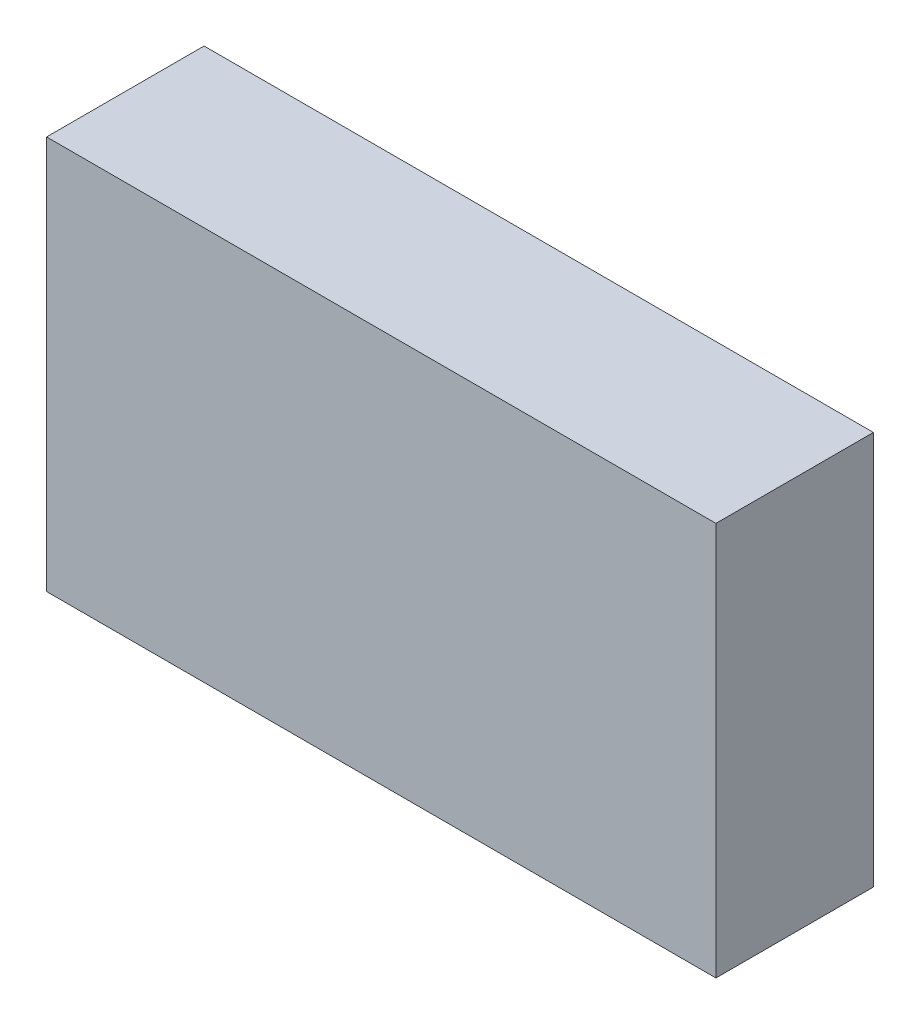
ISO-10303-21;
HEADER;
FILE_DESCRIPTION(('STEP AP214'),'2;1');
FILE_NAME('part.step','',(''),(''),'','','');
FILE_SCHEMA(('AUTOMOTIVE_DESIGN { 1 0 10303 214 1 1 1 1 }'));
ENDSEC;
DATA;
#1=APPLICATION_CONTEXT('core data for automotive mechanical design processes');
#2=APPLICATION_PROTOCOL_DEFINITION('international standard','automotive_design',2000,#1);
#3=PRODUCT_CONTEXT('',#1,'mechanical');
#4=PRODUCT('Part','Part','',(#3));
#5=PRODUCT_RELATED_PRODUCT_CATEGORY('part','',(#4));
#6=PRODUCT_DEFINITION_FORMATION('','',#4);
#7=PRODUCT_DEFINITION_CONTEXT('part definition',#1,'design');
#8=PRODUCT_DEFINITION('design','',#6,#7);
#9=PRODUCT_DEFINITION_SHAPE('','',#8);
#10=(LENGTH_UNIT() NAMED_UNIT(*) SI_UNIT(.MILLI.,.METRE.));
#11=(NAMED_UNIT(*) PLANE_ANGLE_UNIT() SI_UNIT($,.RADIAN.));
#12=(NAMED_UNIT(*) SI_UNIT($,.STERADIAN.) SOLID_ANGLE_UNIT());
#13=UNCERTAINTY_MEASURE_WITH_UNIT(LENGTH_MEASURE(1.E-05),#10,'distance_accuracy_value','');
#14=(GEOMETRIC_REPRESENTATION_CONTEXT(3) GLOBAL_UNCERTAINTY_ASSIGNED_CONTEXT((#13)) GLOBAL_UNIT_ASSIGNED_CONTEXT((#10,
#11,#12)) REPRESENTATION_CONTEXT('',''));
#15=CARTESIAN_POINT('',(0.,0.,0.));
#16=DIRECTION('',(0.,0.,1.));
#17=DIRECTION('',(1.,0.,0.));
#18=AXIS2_PLACEMENT_3D('',#15,#16,#17);
#19=CARTESIAN_POINT('',(950.,1690.,-700.));
#20=DIRECTION('',(-1.,0.,0.));
#21=DIRECTION('',(0.,0.,1.));
#22=AXIS2_PLACEMENT_3D('',#19,#20,#21);
#23=PLANE('',#22);
#24=DIRECTION('',(0.,-1.,0.));
#25=VECTOR('',#24,1.);
#26=CARTESIAN_POINT('',(950.,1690.,-660.));
#27=LINE('',#26,#25);
#28=CARTESIAN_POINT('',(950.,1790.,-660.));
#29=VERTEX_POINT('',#28);
#30=CARTESIAN_POINT('',(950.,1690.,-660.));
#31=VERTEX_POINT('',#30);
#32=EDGE_CURVE('E103',#29,#31,#27,.T.);
#33=ORIENTED_EDGE('',*,*,#32,.F.);
#34=DIRECTION('',(0.,0.,1.));
#35=VECTOR('',#34,1.);
#36=CARTESIAN_POINT('',(950.,1790.,-700.));
#37=LINE('',#36,#35);
#38=CARTESIAN_POINT('',(950.,1790.,-700.));
#39=VERTEX_POINT('',#38);
#40=EDGE_CURVE('E11',#39,#29,#37,.T.);
#41=ORIENTED_EDGE('',*,*,#40,.F.);
#42=DIRECTION('',(0.,-1.,0.));
#43=VECTOR('',#42,1.);
#44=CARTESIAN_POINT('',(950.,1690.,-700.));
#45=LINE('',#44,#43);
#46=CARTESIAN_POINT('',(950.,1690.,-700.));
#47=VERTEX_POINT('',#46);
#48=EDGE_CURVE('E97',#39,#47,#45,.T.);
#49=ORIENTED_EDGE('',*,*,#48,.T.);
#50=DIRECTION('',(0.,0.,1.));
#51=VECTOR('',#50,1.);
#52=CARTESIAN_POINT('',(950.,1690.,-700.));
#53=LINE('',#52,#51);
#54=EDGE_CURVE('E42',#47,#31,#53,.T.);
#55=ORIENTED_EDGE('',*,*,#54,.T.);
#56=EDGE_LOOP('',(#33,#41,#49,#55));
#57=FACE_BOUND('',#56,.T.);
#58=ADVANCED_FACE('F39',(#57),#23,.T.);
#59=CARTESIAN_POINT('',(950.,1790.,-700.));
#60=DIRECTION('',(0.,1.,0.));
#61=DIRECTION('',(0.,0.,1.));
#62=AXIS2_PLACEMENT_3D('',#59,#60,#61);
#63=PLANE('',#62);
#64=DIRECTION('',(-1.,0.,0.));
#65=VECTOR('',#64,1.);
#66=CARTESIAN_POINT('',(950.,1790.,-660.));
#67=LINE('',#66,#65);
#68=CARTESIAN_POINT('',(1120.,1790.,-660.));
#69=VERTEX_POINT('',#68);
#70=EDGE_CURVE('E99',#69,#29,#67,.T.);
#71=ORIENTED_EDGE('',*,*,#70,.F.);
#72=DIRECTION('',(0.,0.,1.));
#73=VECTOR('',#72,1.);
#74=CARTESIAN_POINT('',(1120.,1790.,-700.));
#75=LINE('',#74,#73);
#76=CARTESIAN_POINT('',(1120.,1790.,-700.));
#77=VERTEX_POINT('',#76);
#78=EDGE_CURVE('E48',#77,#69,#75,.T.);
#79=ORIENTED_EDGE('',*,*,#78,.F.);
#80=DIRECTION('',(-1.,0.,0.));
#81=VECTOR('',#80,1.);
#82=CARTESIAN_POINT('',(950.,1790.,-700.));
#83=LINE('',#82,#81);
#84=EDGE_CURVE('E94',#77,#39,#83,.T.);
#85=ORIENTED_EDGE('',*,*,#84,.T.);
#86=ORIENTED_EDGE('',*,*,#40,.T.);
#87=EDGE_LOOP('',(#71,#79,#85,#86));
#88=FACE_BOUND('',#87,.T.);
#89=ADVANCED_FACE('F113',(#88),#63,.T.);
#90=CARTESIAN_POINT('',(1120.,1690.,-700.));
#91=DIRECTION('',(1.,0.,0.));
#92=DIRECTION('',(0.,0.,-1.));
#93=AXIS2_PLACEMENT_3D('',#90,#91,#92);
#94=PLANE('',#93);
#95=DIRECTION('',(0.,1.,0.));
#96=VECTOR('',#95,1.);
#97=CARTESIAN_POINT('',(1120.,1690.,-660.));
#98=LINE('',#97,#96);
#99=CARTESIAN_POINT('',(1120.,1690.,-660.));
#100=VERTEX_POINT('',#99);
#101=EDGE_CURVE('E89',#100,#69,#98,.T.);
#102=ORIENTED_EDGE('',*,*,#101,.F.);
#103=DIRECTION('',(0.,0.,1.));
#104=VECTOR('',#103,1.);
#105=CARTESIAN_POINT('',(1120.,1690.,-700.));
#106=LINE('',#105,#104);
#107=CARTESIAN_POINT('',(1120.,1690.,-700.));
#108=VERTEX_POINT('',#107);
#109=EDGE_CURVE('E84',#108,#100,#106,.T.);
#110=ORIENTED_EDGE('',*,*,#109,.F.);
#111=DIRECTION('',(0.,1.,0.));
#112=VECTOR('',#111,1.);
#113=CARTESIAN_POINT('',(1120.,1690.,-700.));
#114=LINE('',#113,#112);
#115=EDGE_CURVE('E87',#108,#77,#114,.T.);
#116=ORIENTED_EDGE('',*,*,#115,.T.);
#117=ORIENTED_EDGE('',*,*,#78,.T.);
#118=EDGE_LOOP('',(#102,#110,#116,#117));
#119=FACE_BOUND('',#118,.T.);
#120=ADVANCED_FACE('F86',(#119),#94,.T.);
#121=CARTESIAN_POINT('',(950.,1690.,-700.));
#122=DIRECTION('',(0.,-1.,0.));
#123=DIRECTION('',(0.,0.,-1.));
#124=AXIS2_PLACEMENT_3D('',#121,#122,#123);
#125=PLANE('',#124);
#126=DIRECTION('',(1.,0.,0.));
#127=VECTOR('',#126,1.);
#128=CARTESIAN_POINT('',(950.,1690.,-660.));
#129=LINE('',#128,#127);
#130=EDGE_CURVE('E106',#31,#100,#129,.T.);
#131=ORIENTED_EDGE('',*,*,#130,.F.);
#132=ORIENTED_EDGE('',*,*,#54,.F.);
#133=DIRECTION('',(1.,0.,0.));
#134=VECTOR('',#133,1.);
#135=CARTESIAN_POINT('',(950.,1690.,-700.));
#136=LINE('',#135,#134);
#137=EDGE_CURVE('E93',#47,#108,#136,.T.);
#138=ORIENTED_EDGE('',*,*,#137,.T.);
#139=ORIENTED_EDGE('',*,*,#109,.T.);
#140=EDGE_LOOP('',(#131,#132,#138,#139));
#141=FACE_BOUND('',#140,.T.);
#142=ADVANCED_FACE('F96',(#141),#125,.T.);
#143=CARTESIAN_POINT('',(0.,0.,-700.));
#144=DIRECTION('',(0.,0.,-1.));
#145=DIRECTION('',(-1.,0.,0.));
#146=AXIS2_PLACEMENT_3D('',#143,#144,#145);
#147=PLANE('',#146);
#148=ORIENTED_EDGE('',*,*,#48,.F.);
#149=ORIENTED_EDGE('',*,*,#84,.F.);
#150=ORIENTED_EDGE('',*,*,#115,.F.);
#151=ORIENTED_EDGE('',*,*,#137,.F.);
#152=EDGE_LOOP('',(#148,#149,#150,#151));
#153=FACE_BOUND('',#152,.T.);
#154=ADVANCED_FACE('F92',(#153),#147,.T.);
#155=CARTESIAN_POINT('',(0.,0.,-660.));
#156=DIRECTION('',(0.,0.,-1.));
#157=DIRECTION('',(-1.,0.,0.));
#158=AXIS2_PLACEMENT_3D('',#155,#156,#157);
#159=PLANE('',#158);
#160=ORIENTED_EDGE('',*,*,#32,.T.);
#161=ORIENTED_EDGE('',*,*,#130,.T.);
#162=ORIENTED_EDGE('',*,*,#101,.T.);
#163=ORIENTED_EDGE('',*,*,#70,.T.);
#164=EDGE_LOOP('',(#160,#161,#162,#163));
#165=FACE_BOUND('',#164,.T.);
#166=ADVANCED_FACE('F112',(#165),#159,.F.);
#167=CLOSED_SHELL('',(#58,#89,#120,#142,#154,#166));
#168=MANIFOLD_SOLID_BREP('B2',#167);
#169=ADVANCED_BREP_SHAPE_REPRESENTATION('',(#18,#168),#14);
#170=SHAPE_DEFINITION_REPRESENTATION(#9,#169);
ENDSEC;
END-ISO-10303-21;
